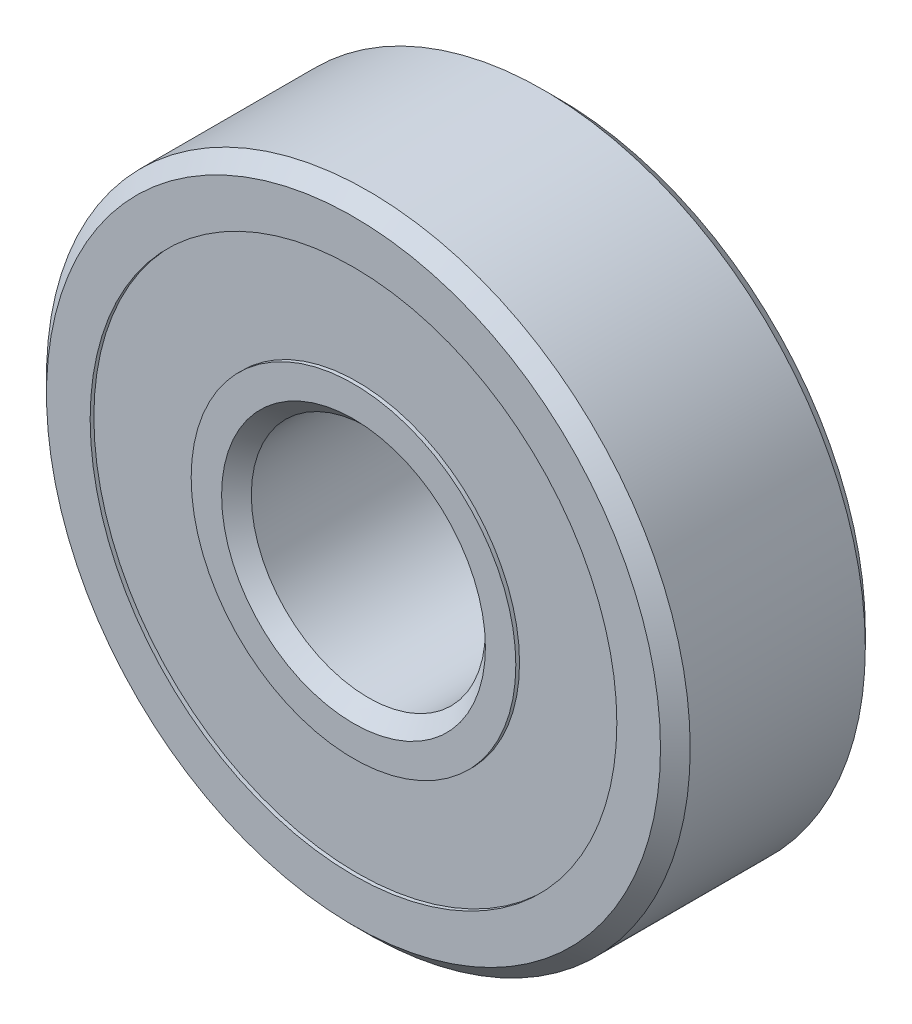
ISO-10303-21;
HEADER;
FILE_DESCRIPTION(('STEP AP214'),'2;1');
FILE_NAME('part.step','',(''),(''),'','','');
FILE_SCHEMA(('AUTOMOTIVE_DESIGN { 1 0 10303 214 1 1 1 1 }'));
ENDSEC;
DATA;
#1=APPLICATION_CONTEXT('core data for automotive mechanical design processes');
#2=APPLICATION_PROTOCOL_DEFINITION('international standard','automotive_design',2000,#1);
#3=PRODUCT_CONTEXT('',#1,'mechanical');
#4=PRODUCT('Part','Part','',(#3));
#5=PRODUCT_RELATED_PRODUCT_CATEGORY('part','',(#4));
#6=PRODUCT_DEFINITION_FORMATION('','',#4);
#7=PRODUCT_DEFINITION_CONTEXT('part definition',#1,'design');
#8=PRODUCT_DEFINITION('design','',#6,#7);
#9=PRODUCT_DEFINITION_SHAPE('','',#8);
#10=(LENGTH_UNIT() NAMED_UNIT(*) SI_UNIT(.MILLI.,.METRE.));
#11=(NAMED_UNIT(*) PLANE_ANGLE_UNIT() SI_UNIT($,.RADIAN.));
#12=(NAMED_UNIT(*) SI_UNIT($,.STERADIAN.) SOLID_ANGLE_UNIT());
#13=UNCERTAINTY_MEASURE_WITH_UNIT(LENGTH_MEASURE(1.E-05),#10,'distance_accuracy_value','');
#14=(GEOMETRIC_REPRESENTATION_CONTEXT(3) GLOBAL_UNCERTAINTY_ASSIGNED_CONTEXT((#13)) GLOBAL_UNIT_ASSIGNED_CONTEXT((#10,
#11,#12)) REPRESENTATION_CONTEXT('',''));
#15=CARTESIAN_POINT('',(0.,0.,0.));
#16=DIRECTION('',(0.,0.,1.));
#17=DIRECTION('',(1.,0.,0.));
#18=AXIS2_PLACEMENT_3D('',#15,#16,#17);
#19=CARTESIAN_POINT('',(0.,0.,7.));
#20=DIRECTION('',(0.,0.,1.));
#21=DIRECTION('',(1.,0.,0.));
#22=AXIS2_PLACEMENT_3D('',#19,#20,#21);
#23=PLANE('',#22);
#24=CARTESIAN_POINT('',(0.,0.,7.));
#25=DIRECTION('',(0.,0.,1.));
#26=DIRECTION('',(1.,0.,0.));
#27=AXIS2_PLACEMENT_3D('',#24,#25,#26);
#28=CIRCLE('',#27,4.50800000000001);
#29=CARTESIAN_POINT('',(4.50800000000001,0.,7.));
#30=VERTEX_POINT('',#29);
#31=EDGE_CURVE('E10',#30,#30,#28,.F.);
#32=ORIENTED_EDGE('',*,*,#31,.T.);
#33=EDGE_LOOP('',(#32));
#34=FACE_BOUND('',#33,.T.);
#35=CARTESIAN_POINT('',(0.,0.,7.));
#36=DIRECTION('',(0.,0.,-1.));
#37=DIRECTION('',(-1.,0.,0.));
#38=AXIS2_PLACEMENT_3D('',#35,#36,#37);
#39=CIRCLE('',#38,5.54763491416447);
#40=CARTESIAN_POINT('',(-5.54763491416447,0.,7.));
#41=VERTEX_POINT('',#40);
#42=EDGE_CURVE('E95',#41,#41,#39,.T.);
#43=ORIENTED_EDGE('',*,*,#42,.F.);
#44=EDGE_LOOP('',(#43));
#45=FACE_BOUND('',#44,.T.);
#46=ADVANCED_FACE('F46',(#34,#45),#23,.T.);
#47=CARTESIAN_POINT('',(0.,0.,0.));
#48=DIRECTION('',(0.,0.,1.));
#49=DIRECTION('',(1.,0.,0.));
#50=AXIS2_PLACEMENT_3D('',#47,#48,#49);
#51=PLANE('',#50);
#52=CARTESIAN_POINT('',(0.,0.,0.));
#53=DIRECTION('',(0.,0.,1.));
#54=DIRECTION('',(1.,0.,0.));
#55=AXIS2_PLACEMENT_3D('',#52,#53,#54);
#56=CIRCLE('',#55,4.);
#57=CARTESIAN_POINT('',(4.,0.,0.));
#58=VERTEX_POINT('',#57);
#59=EDGE_CURVE('E73',#58,#58,#56,.T.);
#60=ORIENTED_EDGE('',*,*,#59,.T.);
#61=EDGE_LOOP('',(#60));
#62=FACE_BOUND('',#61,.T.);
#63=CARTESIAN_POINT('',(0.,0.,0.));
#64=DIRECTION('',(0.,0.,-1.));
#65=DIRECTION('',(-1.,0.,0.));
#66=AXIS2_PLACEMENT_3D('',#63,#64,#65);
#67=CIRCLE('',#66,5.54763491416447);
#68=CARTESIAN_POINT('',(-5.54763491416447,0.,0.));
#69=VERTEX_POINT('',#68);
#70=EDGE_CURVE('E83',#69,#69,#67,.T.);
#71=ORIENTED_EDGE('',*,*,#70,.T.);
#72=EDGE_LOOP('',(#71));
#73=FACE_BOUND('',#72,.T.);
#74=ADVANCED_FACE('F111',(#62,#73),#51,.F.);
#75=CARTESIAN_POINT('',(0.,0.,7.));
#76=DIRECTION('',(0.,0.,-1.));
#77=DIRECTION('',(-1.,0.,0.));
#78=AXIS2_PLACEMENT_3D('',#75,#76,#77);
#79=CIRCLE('',#78,9.00013023394548);
#80=CARTESIAN_POINT('',(-9.00013023394548,0.,7.));
#81=VERTEX_POINT('',#80);
#82=EDGE_CURVE('E89',#81,#81,#79,.T.);
#83=ORIENTED_EDGE('',*,*,#82,.T.);
#84=EDGE_LOOP('',(#83));
#85=FACE_BOUND('',#84,.T.);
#86=CARTESIAN_POINT('',(0.,0.,7.));
#87=DIRECTION('',(0.,0.,1.));
#88=DIRECTION('',(1.,0.,0.));
#89=AXIS2_PLACEMENT_3D('',#86,#87,#88);
#90=CIRCLE('',#89,10.492);
#91=CARTESIAN_POINT('',(10.492,0.,7.));
#92=VERTEX_POINT('',#91);
#93=EDGE_CURVE('E54',#92,#92,#90,.T.);
#94=ORIENTED_EDGE('',*,*,#93,.T.);
#95=EDGE_LOOP('',(#94));
#96=FACE_BOUND('',#95,.T.);
#97=ADVANCED_FACE('F113',(#85,#96),#23,.T.);
#98=CARTESIAN_POINT('',(0.,0.,0.));
#99=DIRECTION('',(0.,0.,-1.));
#100=DIRECTION('',(-1.,0.,0.));
#101=AXIS2_PLACEMENT_3D('',#98,#99,#100);
#102=CIRCLE('',#101,9.00013023394548);
#103=CARTESIAN_POINT('',(-9.00013023394548,0.,0.));
#104=VERTEX_POINT('',#103);
#105=EDGE_CURVE('E77',#104,#104,#102,.T.);
#106=ORIENTED_EDGE('',*,*,#105,.F.);
#107=EDGE_LOOP('',(#106));
#108=FACE_BOUND('',#107,.T.);
#109=CARTESIAN_POINT('',(0.,0.,0.));
#110=DIRECTION('',(0.,0.,1.));
#111=DIRECTION('',(1.,0.,0.));
#112=AXIS2_PLACEMENT_3D('',#109,#110,#111);
#113=CIRCLE('',#112,10.492);
#114=CARTESIAN_POINT('',(10.492,0.,0.));
#115=VERTEX_POINT('',#114);
#116=EDGE_CURVE('E62',#115,#115,#113,.F.);
#117=ORIENTED_EDGE('',*,*,#116,.T.);
#118=EDGE_LOOP('',(#117));
#119=FACE_BOUND('',#118,.T.);
#120=ADVANCED_FACE('F121',(#108,#119),#51,.F.);
#121=CARTESIAN_POINT('',(0.,0.,7.));
#122=DIRECTION('',(0.,0.,-1.));
#123=DIRECTION('',(-1.,0.,0.));
#124=AXIS2_PLACEMENT_3D('',#121,#122,#123);
#125=CYLINDRICAL_SURFACE('',#124,11.);
#126=CARTESIAN_POINT('',(0.,0.,0.507999999999995));
#127=DIRECTION('',(0.,0.,1.));
#128=DIRECTION('',(1.,0.,0.));
#129=AXIS2_PLACEMENT_3D('',#126,#127,#128);
#130=CIRCLE('',#129,11.);
#131=CARTESIAN_POINT('',(11.,0.,0.507999999999995));
#132=VERTEX_POINT('',#131);
#133=EDGE_CURVE('E67',#132,#132,#130,.T.);
#134=ORIENTED_EDGE('',*,*,#133,.T.);
#135=EDGE_LOOP('',(#134));
#136=FACE_BOUND('',#135,.T.);
#137=CARTESIAN_POINT('',(0.,0.,6.49200000000001));
#138=DIRECTION('',(0.,0.,1.));
#139=DIRECTION('',(1.,0.,0.));
#140=AXIS2_PLACEMENT_3D('',#137,#138,#139);
#141=CIRCLE('',#140,11.);
#142=CARTESIAN_POINT('',(11.,0.,6.49200000000001));
#143=VERTEX_POINT('',#142);
#144=EDGE_CURVE('E70',#143,#143,#141,.F.);
#145=ORIENTED_EDGE('',*,*,#144,.T.);
#146=EDGE_LOOP('',(#145));
#147=FACE_BOUND('',#146,.T.);
#148=ADVANCED_FACE('F128',(#136,#147),#125,.T.);
#149=CARTESIAN_POINT('',(0.,0.,7.));
#150=DIRECTION('',(0.,0.,-1.));
#151=DIRECTION('',(-1.,0.,0.));
#152=AXIS2_PLACEMENT_3D('',#149,#150,#151);
#153=CYLINDRICAL_SURFACE('',#152,4.);
#154=CARTESIAN_POINT('',(0.,0.,6.492));
#155=DIRECTION('',(0.,0.,1.));
#156=DIRECTION('',(1.,0.,0.));
#157=AXIS2_PLACEMENT_3D('',#154,#155,#156);
#158=CIRCLE('',#157,4.);
#159=CARTESIAN_POINT('',(4.,0.,6.492));
#160=VERTEX_POINT('',#159);
#161=EDGE_CURVE('E58',#160,#160,#158,.T.);
#162=ORIENTED_EDGE('',*,*,#161,.T.);
#163=EDGE_LOOP('',(#162));
#164=FACE_BOUND('',#163,.T.);
#165=ORIENTED_EDGE('',*,*,#59,.F.);
#166=EDGE_LOOP('',(#165));
#167=FACE_BOUND('',#166,.T.);
#168=ADVANCED_FACE('F152',(#164,#167),#153,.F.);
#169=CARTESIAN_POINT('',(0.,0.,0.507999999999995));
#170=DIRECTION('',(0.,0.,1.));
#171=DIRECTION('',(1.,0.,0.));
#172=AXIS2_PLACEMENT_3D('',#169,#170,#171);
#173=CONICAL_SURFACE('',#172,11.,0.785398163397452);
#174=ORIENTED_EDGE('',*,*,#116,.F.);
#175=EDGE_LOOP('',(#174));
#176=FACE_BOUND('',#175,.T.);
#177=ORIENTED_EDGE('',*,*,#133,.F.);
#178=EDGE_LOOP('',(#177));
#179=FACE_BOUND('',#178,.T.);
#180=ADVANCED_FACE('F154',(#176,#179),#173,.T.);
#181=CARTESIAN_POINT('',(0.,0.,6.492));
#182=DIRECTION('',(0.,0.,1.));
#183=DIRECTION('',(1.,0.,0.));
#184=AXIS2_PLACEMENT_3D('',#181,#182,#183);
#185=CONICAL_SURFACE('',#184,4.,0.785398163397452);
#186=ORIENTED_EDGE('',*,*,#31,.F.);
#187=EDGE_LOOP('',(#186));
#188=FACE_BOUND('',#187,.T.);
#189=ORIENTED_EDGE('',*,*,#161,.F.);
#190=EDGE_LOOP('',(#189));
#191=FACE_BOUND('',#190,.T.);
#192=ADVANCED_FACE('F160',(#188,#191),#185,.F.);
#193=CARTESIAN_POINT('',(0.,0.,7.));
#194=DIRECTION('',(0.,0.,-1.));
#195=DIRECTION('',(-1.,0.,0.));
#196=AXIS2_PLACEMENT_3D('',#193,#194,#195);
#197=CONICAL_SURFACE('',#196,10.492,0.785398163397448);
#198=ORIENTED_EDGE('',*,*,#144,.F.);
#199=EDGE_LOOP('',(#198));
#200=FACE_BOUND('',#199,.T.);
#201=ORIENTED_EDGE('',*,*,#93,.F.);
#202=EDGE_LOOP('',(#201));
#203=FACE_BOUND('',#202,.T.);
#204=ADVANCED_FACE('F49',(#200,#203),#197,.T.);
#205=CARTESIAN_POINT('',(0.,0.,0.127));
#206=DIRECTION('',(0.,0.,-1.));
#207=DIRECTION('',(-1.,0.,0.));
#208=AXIS2_PLACEMENT_3D('',#205,#206,#207);
#209=CYLINDRICAL_SURFACE('',#208,9.00013023394548);
#210=CARTESIAN_POINT('',(0.,0.,0.127));
#211=DIRECTION('',(0.,0.,-1.));
#212=DIRECTION('',(-1.,0.,0.));
#213=AXIS2_PLACEMENT_3D('',#210,#211,#212);
#214=CIRCLE('',#213,9.00013023394548);
#215=CARTESIAN_POINT('',(-9.00013023394548,0.,0.127));
#216=VERTEX_POINT('',#215);
#217=EDGE_CURVE('E76',#216,#216,#214,.T.);
#218=ORIENTED_EDGE('',*,*,#217,.F.);
#219=EDGE_LOOP('',(#218));
#220=FACE_BOUND('',#219,.T.);
#221=ORIENTED_EDGE('',*,*,#105,.T.);
#222=EDGE_LOOP('',(#221));
#223=FACE_BOUND('',#222,.T.);
#224=ADVANCED_FACE('F148',(#220,#223),#209,.F.);
#225=CARTESIAN_POINT('',(0.,0.,0.127));
#226=DIRECTION('',(0.,0.,-1.));
#227=DIRECTION('',(-1.,0.,0.));
#228=AXIS2_PLACEMENT_3D('',#225,#226,#227);
#229=PLANE('',#228);
#230=CARTESIAN_POINT('',(0.,0.,0.127));
#231=DIRECTION('',(0.,0.,-1.));
#232=DIRECTION('',(-1.,0.,0.));
#233=AXIS2_PLACEMENT_3D('',#230,#231,#232);
#234=CIRCLE('',#233,5.54763491416447);
#235=CARTESIAN_POINT('',(-5.54763491416447,0.,0.127));
#236=VERTEX_POINT('',#235);
#237=EDGE_CURVE('E80',#236,#236,#234,.T.);
#238=ORIENTED_EDGE('',*,*,#237,.F.);
#239=EDGE_LOOP('',(#238));
#240=FACE_BOUND('',#239,.T.);
#241=ORIENTED_EDGE('',*,*,#217,.T.);
#242=EDGE_LOOP('',(#241));
#243=FACE_BOUND('',#242,.T.);
#244=ADVANCED_FACE('F144',(#240,#243),#229,.T.);
#245=CARTESIAN_POINT('',(0.,0.,0.127));
#246=DIRECTION('',(0.,0.,-1.));
#247=DIRECTION('',(-1.,0.,0.));
#248=AXIS2_PLACEMENT_3D('',#245,#246,#247);
#249=CYLINDRICAL_SURFACE('',#248,5.54763491416447);
#250=ORIENTED_EDGE('',*,*,#237,.T.);
#251=EDGE_LOOP('',(#250));
#252=FACE_BOUND('',#251,.T.);
#253=ORIENTED_EDGE('',*,*,#70,.F.);
#254=EDGE_LOOP('',(#253));
#255=FACE_BOUND('',#254,.T.);
#256=ADVANCED_FACE('F138',(#252,#255),#249,.T.);
#257=CARTESIAN_POINT('',(0.,0.,6.873));
#258=DIRECTION('',(0.,0.,1.));
#259=DIRECTION('',(-1.,0.,0.));
#260=AXIS2_PLACEMENT_3D('',#257,#258,#259);
#261=PLANE('',#260);
#262=CARTESIAN_POINT('',(0.,0.,6.873));
#263=DIRECTION('',(0.,0.,-1.));
#264=DIRECTION('',(-1.,0.,0.));
#265=AXIS2_PLACEMENT_3D('',#262,#263,#264);
#266=CIRCLE('',#265,9.00013023394548);
#267=CARTESIAN_POINT('',(-9.00013023394548,0.,6.873));
#268=VERTEX_POINT('',#267);
#269=EDGE_CURVE('E86',#268,#268,#266,.T.);
#270=ORIENTED_EDGE('',*,*,#269,.F.);
#271=EDGE_LOOP('',(#270));
#272=FACE_BOUND('',#271,.T.);
#273=CARTESIAN_POINT('',(0.,0.,6.873));
#274=DIRECTION('',(0.,0.,-1.));
#275=DIRECTION('',(-1.,0.,0.));
#276=AXIS2_PLACEMENT_3D('',#273,#274,#275);
#277=CIRCLE('',#276,5.54763491416447);
#278=CARTESIAN_POINT('',(-5.54763491416447,0.,6.873));
#279=VERTEX_POINT('',#278);
#280=EDGE_CURVE('E92',#279,#279,#277,.T.);
#281=ORIENTED_EDGE('',*,*,#280,.T.);
#282=EDGE_LOOP('',(#281));
#283=FACE_BOUND('',#282,.T.);
#284=ADVANCED_FACE('F101',(#272,#283),#261,.T.);
#285=CARTESIAN_POINT('',(0.,0.,6.873));
#286=DIRECTION('',(0.,0.,1.));
#287=DIRECTION('',(1.,0.,0.));
#288=AXIS2_PLACEMENT_3D('',#285,#286,#287);
#289=CYLINDRICAL_SURFACE('',#288,9.00013023394548);
#290=ORIENTED_EDGE('',*,*,#269,.T.);
#291=EDGE_LOOP('',(#290));
#292=FACE_BOUND('',#291,.T.);
#293=ORIENTED_EDGE('',*,*,#82,.F.);
#294=EDGE_LOOP('',(#293));
#295=FACE_BOUND('',#294,.T.);
#296=ADVANCED_FACE('F106',(#292,#295),#289,.F.);
#297=CARTESIAN_POINT('',(0.,0.,6.873));
#298=DIRECTION('',(0.,0.,1.));
#299=DIRECTION('',(1.,0.,0.));
#300=AXIS2_PLACEMENT_3D('',#297,#298,#299);
#301=CYLINDRICAL_SURFACE('',#300,5.54763491416447);
#302=ORIENTED_EDGE('',*,*,#280,.F.);
#303=EDGE_LOOP('',(#302));
#304=FACE_BOUND('',#303,.T.);
#305=ORIENTED_EDGE('',*,*,#42,.T.);
#306=EDGE_LOOP('',(#305));
#307=FACE_BOUND('',#306,.T.);
#308=ADVANCED_FACE('F103',(#304,#307),#301,.T.);
#309=CLOSED_SHELL('',(#46,#74,#97,#120,#148,#168,#180,#192,#204,#224,#244,#256,#284,#296,#308));
#310=MANIFOLD_SOLID_BREP('B2',#309);
#311=ADVANCED_BREP_SHAPE_REPRESENTATION('',(#18,#310),#14);
#312=SHAPE_DEFINITION_REPRESENTATION(#9,#311);
ENDSEC;
END-ISO-10303-21;
